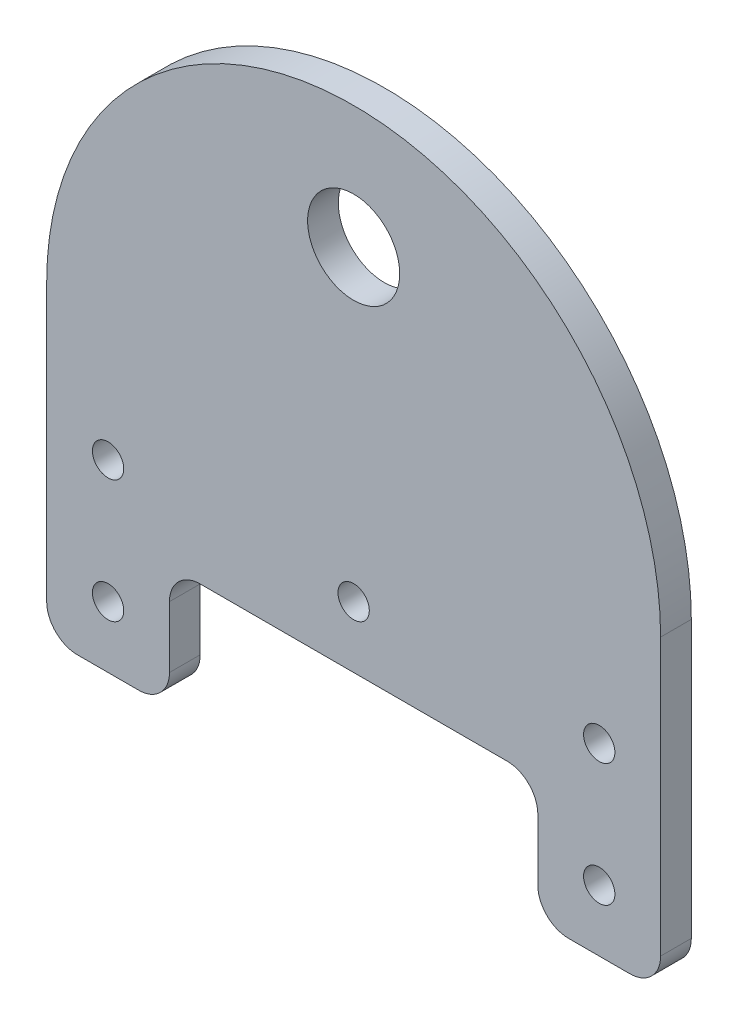
ISO-10303-21;
HEADER;
FILE_DESCRIPTION(('STEP AP214'),'2;1');
FILE_NAME('part.step','',(''),(''),'','','');
FILE_SCHEMA(('AUTOMOTIVE_DESIGN { 1 0 10303 214 1 1 1 1 }'));
ENDSEC;
DATA;
#1=APPLICATION_CONTEXT('core data for automotive mechanical design processes');
#2=APPLICATION_PROTOCOL_DEFINITION('international standard','automotive_design',2000,#1);
#3=PRODUCT_CONTEXT('',#1,'mechanical');
#4=PRODUCT('Part','Part','',(#3));
#5=PRODUCT_RELATED_PRODUCT_CATEGORY('part','',(#4));
#6=PRODUCT_DEFINITION_FORMATION('','',#4);
#7=PRODUCT_DEFINITION_CONTEXT('part definition',#1,'design');
#8=PRODUCT_DEFINITION('design','',#6,#7);
#9=PRODUCT_DEFINITION_SHAPE('','',#8);
#10=(LENGTH_UNIT() NAMED_UNIT(*) SI_UNIT(.MILLI.,.METRE.));
#11=(NAMED_UNIT(*) PLANE_ANGLE_UNIT() SI_UNIT($,.RADIAN.));
#12=(NAMED_UNIT(*) SI_UNIT($,.STERADIAN.) SOLID_ANGLE_UNIT());
#13=UNCERTAINTY_MEASURE_WITH_UNIT(LENGTH_MEASURE(1.E-05),#10,'distance_accuracy_value','');
#14=(GEOMETRIC_REPRESENTATION_CONTEXT(3) GLOBAL_UNCERTAINTY_ASSIGNED_CONTEXT((#13)) GLOBAL_UNIT_ASSIGNED_CONTEXT((#10,
#11,#12)) REPRESENTATION_CONTEXT('',''));
#15=CARTESIAN_POINT('',(0.,0.,0.));
#16=DIRECTION('',(0.,0.,1.));
#17=DIRECTION('',(1.,0.,0.));
#18=AXIS2_PLACEMENT_3D('',#15,#16,#17);
#19=CARTESIAN_POINT('',(-50.,-60.,5.));
#20=DIRECTION('',(0.,1.,0.));
#21=DIRECTION('',(0.,0.,1.));
#22=AXIS2_PLACEMENT_3D('',#19,#20,#21);
#23=PLANE('',#22);
#24=DIRECTION('',(1.,0.,0.));
#25=VECTOR('',#24,1.);
#26=CARTESIAN_POINT('',(-50.,-60.,5.));
#27=LINE('',#26,#25);
#28=CARTESIAN_POINT('',(-25.,-60.,5.));
#29=VERTEX_POINT('',#28);
#30=CARTESIAN_POINT('',(25.,-60.,5.));
#31=VERTEX_POINT('',#30);
#32=EDGE_CURVE('E154',#29,#31,#27,.T.);
#33=ORIENTED_EDGE('',*,*,#32,.F.);
#34=DIRECTION('',(0.,0.,1.));
#35=VECTOR('',#34,1.);
#36=CARTESIAN_POINT('',(-25.,-60.,5.));
#37=LINE('',#36,#35);
#38=CARTESIAN_POINT('',(-25.,-60.,0.));
#39=VERTEX_POINT('',#38);
#40=EDGE_CURVE('E201',#29,#39,#37,.F.);
#41=ORIENTED_EDGE('',*,*,#40,.T.);
#42=DIRECTION('',(1.,0.,0.));
#43=VECTOR('',#42,1.);
#44=CARTESIAN_POINT('',(-50.,-60.,0.));
#45=LINE('',#44,#43);
#46=CARTESIAN_POINT('',(25.,-60.,0.));
#47=VERTEX_POINT('',#46);
#48=EDGE_CURVE('E180',#39,#47,#45,.T.);
#49=ORIENTED_EDGE('',*,*,#48,.T.);
#50=DIRECTION('',(0.,0.,1.));
#51=VECTOR('',#50,1.);
#52=CARTESIAN_POINT('',(25.,-60.,5.));
#53=LINE('',#52,#51);
#54=EDGE_CURVE('E197',#47,#31,#53,.T.);
#55=ORIENTED_EDGE('',*,*,#54,.T.);
#56=EDGE_LOOP('',(#33,#41,#49,#55));
#57=FACE_BOUND('',#56,.T.);
#58=ADVANCED_FACE('F39',(#57),#23,.F.);
#59=CARTESIAN_POINT('',(0.,-30.,5.));
#60=DIRECTION('',(0.,0.,-1.));
#61=DIRECTION('',(-1.,0.,0.));
#62=AXIS2_PLACEMENT_3D('',#59,#60,#61);
#63=PLANE('',#62);
#64=DIRECTION('',(1.,0.,0.));
#65=VECTOR('',#64,1.);
#66=CARTESIAN_POINT('',(50.,-80.,5.));
#67=LINE('',#66,#65);
#68=CARTESIAN_POINT('',(35.,-80.,5.));
#69=VERTEX_POINT('',#68);
#70=CARTESIAN_POINT('',(45.,-80.,5.));
#71=VERTEX_POINT('',#70);
#72=EDGE_CURVE('E273',#69,#71,#67,.T.);
#73=ORIENTED_EDGE('',*,*,#72,.T.);
#74=CARTESIAN_POINT('',(45.,-75.,5.));
#75=DIRECTION('',(0.,0.,-1.));
#76=DIRECTION('',(-1.,0.,0.));
#77=AXIS2_PLACEMENT_3D('',#74,#75,#76);
#78=CIRCLE('',#77,5.);
#79=CARTESIAN_POINT('',(50.,-75.,5.));
#80=VERTEX_POINT('',#79);
#81=EDGE_CURVE('E150',#71,#80,#78,.F.);
#82=ORIENTED_EDGE('',*,*,#81,.T.);
#83=DIRECTION('',(0.,1.,0.));
#84=VECTOR('',#83,1.);
#85=CARTESIAN_POINT('',(50.,-30.,5.));
#86=LINE('',#85,#84);
#87=CARTESIAN_POINT('',(50.,-30.,5.));
#88=VERTEX_POINT('',#87);
#89=EDGE_CURVE('E141',#80,#88,#86,.T.);
#90=ORIENTED_EDGE('',*,*,#89,.T.);
#91=CARTESIAN_POINT('',(0.,-30.,5.));
#92=DIRECTION('',(0.,0.,1.));
#93=DIRECTION('',(-1.,0.,0.));
#94=AXIS2_PLACEMENT_3D('',#91,#92,#93);
#95=CIRCLE('',#94,50.);
#96=CARTESIAN_POINT('',(-50.,-30.,5.));
#97=VERTEX_POINT('',#96);
#98=EDGE_CURVE('E148',#88,#97,#95,.T.);
#99=ORIENTED_EDGE('',*,*,#98,.T.);
#100=DIRECTION('',(0.,-1.,0.));
#101=VECTOR('',#100,1.);
#102=CARTESIAN_POINT('',(-50.,-30.,5.));
#103=LINE('',#102,#101);
#104=CARTESIAN_POINT('',(-50.,-75.,5.));
#105=VERTEX_POINT('',#104);
#106=EDGE_CURVE('E189',#97,#105,#103,.T.);
#107=ORIENTED_EDGE('',*,*,#106,.T.);
#108=CARTESIAN_POINT('',(-45.,-75.,5.));
#109=DIRECTION('',(0.,0.,-1.));
#110=DIRECTION('',(-1.,0.,0.));
#111=AXIS2_PLACEMENT_3D('',#108,#109,#110);
#112=CIRCLE('',#111,5.);
#113=CARTESIAN_POINT('',(-45.,-80.,5.));
#114=VERTEX_POINT('',#113);
#115=EDGE_CURVE('E218',#105,#114,#112,.F.);
#116=ORIENTED_EDGE('',*,*,#115,.T.);
#117=DIRECTION('',(1.,0.,0.));
#118=VECTOR('',#117,1.);
#119=CARTESIAN_POINT('',(-50.,-80.,5.));
#120=LINE('',#119,#118);
#121=CARTESIAN_POINT('',(-35.,-80.,5.));
#122=VERTEX_POINT('',#121);
#123=EDGE_CURVE('E346',#114,#122,#120,.T.);
#124=ORIENTED_EDGE('',*,*,#123,.T.);
#125=CARTESIAN_POINT('',(-35.,-75.,5.));
#126=DIRECTION('',(0.,0.,-1.));
#127=DIRECTION('',(-1.,0.,0.));
#128=AXIS2_PLACEMENT_3D('',#125,#126,#127);
#129=CIRCLE('',#128,5.);
#130=CARTESIAN_POINT('',(-30.,-75.,5.));
#131=VERTEX_POINT('',#130);
#132=EDGE_CURVE('E221',#122,#131,#129,.F.);
#133=ORIENTED_EDGE('',*,*,#132,.T.);
#134=DIRECTION('',(0.,1.,0.));
#135=VECTOR('',#134,1.);
#136=CARTESIAN_POINT('',(-30.,-60.,5.));
#137=LINE('',#136,#135);
#138=CARTESIAN_POINT('',(-30.,-65.,5.));
#139=VERTEX_POINT('',#138);
#140=EDGE_CURVE('E344',#131,#139,#137,.T.);
#141=ORIENTED_EDGE('',*,*,#140,.T.);
#142=CARTESIAN_POINT('',(-25.,-65.,5.));
#143=DIRECTION('',(0.,0.,-1.));
#144=DIRECTION('',(-1.,0.,0.));
#145=AXIS2_PLACEMENT_3D('',#142,#143,#144);
#146=CIRCLE('',#145,5.);
#147=EDGE_CURVE('E253',#139,#29,#146,.T.);
#148=ORIENTED_EDGE('',*,*,#147,.T.);
#149=ORIENTED_EDGE('',*,*,#32,.T.);
#150=CARTESIAN_POINT('',(25.,-65.,5.));
#151=DIRECTION('',(0.,0.,-1.));
#152=DIRECTION('',(-1.,0.,0.));
#153=AXIS2_PLACEMENT_3D('',#150,#151,#152);
#154=CIRCLE('',#153,5.);
#155=CARTESIAN_POINT('',(30.,-65.,5.));
#156=VERTEX_POINT('',#155);
#157=EDGE_CURVE('E48',#31,#156,#154,.T.);
#158=ORIENTED_EDGE('',*,*,#157,.T.);
#159=DIRECTION('',(0.,-1.,0.));
#160=VECTOR('',#159,1.);
#161=CARTESIAN_POINT('',(30.,-60.,5.));
#162=LINE('',#161,#160);
#163=CARTESIAN_POINT('',(30.,-75.,5.));
#164=VERTEX_POINT('',#163);
#165=EDGE_CURVE('E262',#156,#164,#162,.T.);
#166=ORIENTED_EDGE('',*,*,#165,.T.);
#167=CARTESIAN_POINT('',(35.,-75.,5.));
#168=DIRECTION('',(0.,0.,-1.));
#169=DIRECTION('',(-1.,0.,0.));
#170=AXIS2_PLACEMENT_3D('',#167,#168,#169);
#171=CIRCLE('',#170,5.);
#172=EDGE_CURVE('E224',#164,#69,#171,.F.);
#173=ORIENTED_EDGE('',*,*,#172,.T.);
#174=EDGE_LOOP('',(#73,#82,#90,#99,#107,#116,#124,#133,#141,#148,#149,#158,#166,#173));
#175=FACE_BOUND('',#174,.T.);
#176=CARTESIAN_POINT('',(0.,0.,5.));
#177=DIRECTION('',(0.,0.,1.));
#178=DIRECTION('',(1.,0.,0.));
#179=AXIS2_PLACEMENT_3D('',#176,#177,#178);
#180=CIRCLE('',#179,7.5);
#181=CARTESIAN_POINT('',(7.5,0.,5.));
#182=VERTEX_POINT('',#181);
#183=EDGE_CURVE('E181',#182,#182,#180,.T.);
#184=ORIENTED_EDGE('',*,*,#183,.F.);
#185=EDGE_LOOP('',(#184));
#186=FACE_BOUND('',#185,.T.);
#187=CARTESIAN_POINT('',(0.,-50.,5.));
#188=DIRECTION('',(0.,0.,1.));
#189=DIRECTION('',(1.,0.,0.));
#190=AXIS2_PLACEMENT_3D('',#187,#188,#189);
#191=CIRCLE('',#190,2.55);
#192=CARTESIAN_POINT('',(2.55000000000001,-50.,5.));
#193=VERTEX_POINT('',#192);
#194=EDGE_CURVE('E325',#193,#193,#191,.T.);
#195=ORIENTED_EDGE('',*,*,#194,.F.);
#196=EDGE_LOOP('',(#195));
#197=FACE_BOUND('',#196,.T.);
#198=CARTESIAN_POINT('',(-40.,-50.,5.));
#199=DIRECTION('',(0.,0.,1.));
#200=DIRECTION('',(1.,0.,0.));
#201=AXIS2_PLACEMENT_3D('',#198,#199,#200);
#202=CIRCLE('',#201,2.54999999999999);
#203=CARTESIAN_POINT('',(-37.45,-50.,5.));
#204=VERTEX_POINT('',#203);
#205=EDGE_CURVE('E317',#204,#204,#202,.T.);
#206=ORIENTED_EDGE('',*,*,#205,.F.);
#207=EDGE_LOOP('',(#206));
#208=FACE_BOUND('',#207,.T.);
#209=CARTESIAN_POINT('',(40.,-50.,5.));
#210=DIRECTION('',(0.,0.,1.));
#211=DIRECTION('',(1.,0.,0.));
#212=AXIS2_PLACEMENT_3D('',#209,#210,#211);
#213=CIRCLE('',#212,2.55);
#214=CARTESIAN_POINT('',(42.55,-50.,5.));
#215=VERTEX_POINT('',#214);
#216=EDGE_CURVE('E307',#215,#215,#213,.T.);
#217=ORIENTED_EDGE('',*,*,#216,.F.);
#218=EDGE_LOOP('',(#217));
#219=FACE_BOUND('',#218,.T.);
#220=CARTESIAN_POINT('',(-40.,-70.,5.));
#221=DIRECTION('',(0.,0.,1.));
#222=DIRECTION('',(1.,0.,0.));
#223=AXIS2_PLACEMENT_3D('',#220,#221,#222);
#224=CIRCLE('',#223,2.54999999999999);
#225=CARTESIAN_POINT('',(-37.45,-70.,5.));
#226=VERTEX_POINT('',#225);
#227=EDGE_CURVE('E301',#226,#226,#224,.T.);
#228=ORIENTED_EDGE('',*,*,#227,.F.);
#229=EDGE_LOOP('',(#228));
#230=FACE_BOUND('',#229,.T.);
#231=CARTESIAN_POINT('',(40.,-70.,5.));
#232=DIRECTION('',(0.,0.,1.));
#233=DIRECTION('',(-1.,0.,0.));
#234=AXIS2_PLACEMENT_3D('',#231,#232,#233);
#235=CIRCLE('',#234,2.54999999999999);
#236=CARTESIAN_POINT('',(37.45,-70.,5.));
#237=VERTEX_POINT('',#236);
#238=EDGE_CURVE('E274',#237,#237,#235,.T.);
#239=ORIENTED_EDGE('',*,*,#238,.F.);
#240=EDGE_LOOP('',(#239));
#241=FACE_BOUND('',#240,.T.);
#242=ADVANCED_FACE('F144',(#175,#186,#197,#208,#219,#230,#241),#63,.F.);
#243=CARTESIAN_POINT('',(0.,-30.,0.));
#244=DIRECTION('',(0.,0.,-1.));
#245=DIRECTION('',(-1.,0.,0.));
#246=AXIS2_PLACEMENT_3D('',#243,#244,#245);
#247=PLANE('',#246);
#248=CARTESIAN_POINT('',(-40.,-50.,0.));
#249=DIRECTION('',(0.,0.,1.));
#250=DIRECTION('',(1.,0.,0.));
#251=AXIS2_PLACEMENT_3D('',#248,#249,#250);
#252=CIRCLE('',#251,2.54999999999999);
#253=CARTESIAN_POINT('',(-37.45,-50.,0.));
#254=VERTEX_POINT('',#253);
#255=EDGE_CURVE('E311',#254,#254,#252,.T.);
#256=ORIENTED_EDGE('',*,*,#255,.T.);
#257=EDGE_LOOP('',(#256));
#258=FACE_BOUND('',#257,.T.);
#259=CARTESIAN_POINT('',(0.,0.,0.));
#260=DIRECTION('',(0.,0.,1.));
#261=DIRECTION('',(1.,0.,0.));
#262=AXIS2_PLACEMENT_3D('',#259,#260,#261);
#263=CIRCLE('',#262,7.5);
#264=CARTESIAN_POINT('',(7.5,0.,0.));
#265=VERTEX_POINT('',#264);
#266=EDGE_CURVE('E329',#265,#265,#263,.T.);
#267=ORIENTED_EDGE('',*,*,#266,.T.);
#268=EDGE_LOOP('',(#267));
#269=FACE_BOUND('',#268,.T.);
#270=DIRECTION('',(0.,1.,0.));
#271=VECTOR('',#270,1.);
#272=CARTESIAN_POINT('',(50.,-30.,0.));
#273=LINE('',#272,#271);
#274=CARTESIAN_POINT('',(50.,-75.,0.));
#275=VERTEX_POINT('',#274);
#276=CARTESIAN_POINT('',(50.,-30.,0.));
#277=VERTEX_POINT('',#276);
#278=EDGE_CURVE('E160',#275,#277,#273,.T.);
#279=ORIENTED_EDGE('',*,*,#278,.F.);
#280=CARTESIAN_POINT('',(45.,-75.,0.));
#281=DIRECTION('',(0.,0.,-1.));
#282=DIRECTION('',(-1.,0.,0.));
#283=AXIS2_PLACEMENT_3D('',#280,#281,#282);
#284=CIRCLE('',#283,5.);
#285=CARTESIAN_POINT('',(45.,-80.,0.));
#286=VERTEX_POINT('',#285);
#287=EDGE_CURVE('E240',#275,#286,#284,.T.);
#288=ORIENTED_EDGE('',*,*,#287,.T.);
#289=DIRECTION('',(1.,0.,0.));
#290=VECTOR('',#289,1.);
#291=CARTESIAN_POINT('',(50.,-80.,0.));
#292=LINE('',#291,#290);
#293=CARTESIAN_POINT('',(35.,-80.,0.));
#294=VERTEX_POINT('',#293);
#295=EDGE_CURVE('E356',#294,#286,#292,.T.);
#296=ORIENTED_EDGE('',*,*,#295,.F.);
#297=CARTESIAN_POINT('',(35.,-75.,0.));
#298=DIRECTION('',(0.,0.,-1.));
#299=DIRECTION('',(-1.,0.,0.));
#300=AXIS2_PLACEMENT_3D('',#297,#298,#299);
#301=CIRCLE('',#300,5.);
#302=CARTESIAN_POINT('',(30.,-75.,0.));
#303=VERTEX_POINT('',#302);
#304=EDGE_CURVE('E237',#294,#303,#301,.T.);
#305=ORIENTED_EDGE('',*,*,#304,.T.);
#306=DIRECTION('',(0.,-1.,0.));
#307=VECTOR('',#306,1.);
#308=CARTESIAN_POINT('',(30.,-60.,0.));
#309=LINE('',#308,#307);
#310=CARTESIAN_POINT('',(30.,-65.,0.));
#311=VERTEX_POINT('',#310);
#312=EDGE_CURVE('E282',#311,#303,#309,.T.);
#313=ORIENTED_EDGE('',*,*,#312,.F.);
#314=CARTESIAN_POINT('',(25.,-65.,0.));
#315=DIRECTION('',(0.,0.,-1.));
#316=DIRECTION('',(-1.,0.,0.));
#317=AXIS2_PLACEMENT_3D('',#314,#315,#316);
#318=CIRCLE('',#317,5.);
#319=EDGE_CURVE('E11',#311,#47,#318,.F.);
#320=ORIENTED_EDGE('',*,*,#319,.T.);
#321=ORIENTED_EDGE('',*,*,#48,.F.);
#322=CARTESIAN_POINT('',(-25.,-65.,0.));
#323=DIRECTION('',(0.,0.,-1.));
#324=DIRECTION('',(-1.,0.,0.));
#325=AXIS2_PLACEMENT_3D('',#322,#323,#324);
#326=CIRCLE('',#325,5.);
#327=CARTESIAN_POINT('',(-30.,-65.,0.));
#328=VERTEX_POINT('',#327);
#329=EDGE_CURVE('E256',#39,#328,#326,.F.);
#330=ORIENTED_EDGE('',*,*,#329,.T.);
#331=DIRECTION('',(0.,1.,0.));
#332=VECTOR('',#331,1.);
#333=CARTESIAN_POINT('',(-30.,-60.,0.));
#334=LINE('',#333,#332);
#335=CARTESIAN_POINT('',(-30.,-75.,0.));
#336=VERTEX_POINT('',#335);
#337=EDGE_CURVE('E289',#336,#328,#334,.T.);
#338=ORIENTED_EDGE('',*,*,#337,.F.);
#339=CARTESIAN_POINT('',(-35.,-75.,0.));
#340=DIRECTION('',(0.,0.,-1.));
#341=DIRECTION('',(-1.,0.,0.));
#342=AXIS2_PLACEMENT_3D('',#339,#340,#341);
#343=CIRCLE('',#342,5.);
#344=CARTESIAN_POINT('',(-35.,-80.,0.));
#345=VERTEX_POINT('',#344);
#346=EDGE_CURVE('E55',#336,#345,#343,.T.);
#347=ORIENTED_EDGE('',*,*,#346,.T.);
#348=DIRECTION('',(1.,0.,0.));
#349=VECTOR('',#348,1.);
#350=CARTESIAN_POINT('',(-50.,-80.,0.));
#351=LINE('',#350,#349);
#352=CARTESIAN_POINT('',(-45.,-80.,0.));
#353=VERTEX_POINT('',#352);
#354=EDGE_CURVE('E296',#353,#345,#351,.T.);
#355=ORIENTED_EDGE('',*,*,#354,.F.);
#356=CARTESIAN_POINT('',(-45.,-75.,0.));
#357=DIRECTION('',(0.,0.,-1.));
#358=DIRECTION('',(-1.,0.,0.));
#359=AXIS2_PLACEMENT_3D('',#356,#357,#358);
#360=CIRCLE('',#359,5.);
#361=CARTESIAN_POINT('',(-50.,-75.,0.));
#362=VERTEX_POINT('',#361);
#363=EDGE_CURVE('E232',#353,#362,#360,.T.);
#364=ORIENTED_EDGE('',*,*,#363,.T.);
#365=DIRECTION('',(0.,-1.,0.));
#366=VECTOR('',#365,1.);
#367=CARTESIAN_POINT('',(-50.,-30.,0.));
#368=LINE('',#367,#366);
#369=CARTESIAN_POINT('',(-50.,-30.,0.));
#370=VERTEX_POINT('',#369);
#371=EDGE_CURVE('E176',#370,#362,#368,.T.);
#372=ORIENTED_EDGE('',*,*,#371,.F.);
#373=CARTESIAN_POINT('',(0.,-30.,0.));
#374=DIRECTION('',(0.,0.,1.));
#375=DIRECTION('',(-1.,0.,0.));
#376=AXIS2_PLACEMENT_3D('',#373,#374,#375);
#377=CIRCLE('',#376,50.);
#378=EDGE_CURVE('E187',#277,#370,#377,.T.);
#379=ORIENTED_EDGE('',*,*,#378,.F.);
#380=EDGE_LOOP('',(#279,#288,#296,#305,#313,#320,#321,#330,#338,#347,#355,#364,#372,#379));
#381=FACE_BOUND('',#380,.T.);
#382=CARTESIAN_POINT('',(0.,-50.,0.));
#383=DIRECTION('',(0.,0.,1.));
#384=DIRECTION('',(1.,0.,0.));
#385=AXIS2_PLACEMENT_3D('',#382,#383,#384);
#386=CIRCLE('',#385,2.55);
#387=CARTESIAN_POINT('',(2.55000000000001,-50.,0.));
#388=VERTEX_POINT('',#387);
#389=EDGE_CURVE('E321',#388,#388,#386,.T.);
#390=ORIENTED_EDGE('',*,*,#389,.T.);
#391=EDGE_LOOP('',(#390));
#392=FACE_BOUND('',#391,.T.);
#393=CARTESIAN_POINT('',(40.,-50.,0.));
#394=DIRECTION('',(0.,0.,1.));
#395=DIRECTION('',(1.,0.,0.));
#396=AXIS2_PLACEMENT_3D('',#393,#394,#395);
#397=CIRCLE('',#396,2.55);
#398=CARTESIAN_POINT('',(42.55,-50.,0.));
#399=VERTEX_POINT('',#398);
#400=EDGE_CURVE('E312',#399,#399,#397,.T.);
#401=ORIENTED_EDGE('',*,*,#400,.T.);
#402=EDGE_LOOP('',(#401));
#403=FACE_BOUND('',#402,.T.);
#404=CARTESIAN_POINT('',(-40.,-70.,0.));
#405=DIRECTION('',(0.,0.,-1.));
#406=DIRECTION('',(-1.,0.,0.));
#407=AXIS2_PLACEMENT_3D('',#404,#405,#406);
#408=CIRCLE('',#407,2.54999999999999);
#409=CARTESIAN_POINT('',(-42.55,-70.,0.));
#410=VERTEX_POINT('',#409);
#411=EDGE_CURVE('E316',#410,#410,#408,.F.);
#412=ORIENTED_EDGE('',*,*,#411,.T.);
#413=EDGE_LOOP('',(#412));
#414=FACE_BOUND('',#413,.T.);
#415=CARTESIAN_POINT('',(40.,-70.,0.));
#416=DIRECTION('',(0.,0.,-1.));
#417=DIRECTION('',(-1.,0.,0.));
#418=AXIS2_PLACEMENT_3D('',#415,#416,#417);
#419=CIRCLE('',#418,2.54999999999999);
#420=CARTESIAN_POINT('',(37.45,-70.,0.));
#421=VERTEX_POINT('',#420);
#422=EDGE_CURVE('E297',#421,#421,#419,.F.);
#423=ORIENTED_EDGE('',*,*,#422,.T.);
#424=EDGE_LOOP('',(#423));
#425=FACE_BOUND('',#424,.T.);
#426=ADVANCED_FACE('F279',(#258,#269,#381,#392,#403,#414,#425),#247,.T.);
#427=CARTESIAN_POINT('',(-50.,-30.,5.));
#428=DIRECTION('',(1.,0.,0.));
#429=DIRECTION('',(0.,0.,-1.));
#430=AXIS2_PLACEMENT_3D('',#427,#428,#429);
#431=PLANE('',#430);
#432=ORIENTED_EDGE('',*,*,#371,.T.);
#433=DIRECTION('',(0.,0.,1.));
#434=VECTOR('',#433,1.);
#435=CARTESIAN_POINT('',(-50.,-75.,5.));
#436=LINE('',#435,#434);
#437=EDGE_CURVE('E249',#362,#105,#436,.T.);
#438=ORIENTED_EDGE('',*,*,#437,.T.);
#439=ORIENTED_EDGE('',*,*,#106,.F.);
#440=DIRECTION('',(0.,0.,-1.));
#441=VECTOR('',#440,1.);
#442=CARTESIAN_POINT('',(-50.,-30.,5.));
#443=LINE('',#442,#441);
#444=EDGE_CURVE('E165',#97,#370,#443,.T.);
#445=ORIENTED_EDGE('',*,*,#444,.T.);
#446=EDGE_LOOP('',(#432,#438,#439,#445));
#447=FACE_BOUND('',#446,.T.);
#448=ADVANCED_FACE('F380',(#447),#431,.F.);
#449=CARTESIAN_POINT('',(50.,-30.,5.));
#450=DIRECTION('',(-1.,0.,0.));
#451=DIRECTION('',(0.,-1.,0.));
#452=AXIS2_PLACEMENT_3D('',#449,#450,#451);
#453=PLANE('',#452);
#454=ORIENTED_EDGE('',*,*,#89,.F.);
#455=DIRECTION('',(0.,0.,1.));
#456=VECTOR('',#455,1.);
#457=CARTESIAN_POINT('',(50.,-75.,0.));
#458=LINE('',#457,#456);
#459=EDGE_CURVE('E229',#80,#275,#458,.F.);
#460=ORIENTED_EDGE('',*,*,#459,.T.);
#461=ORIENTED_EDGE('',*,*,#278,.T.);
#462=DIRECTION('',(0.,0.,-1.));
#463=VECTOR('',#462,1.);
#464=CARTESIAN_POINT('',(50.,-30.,5.));
#465=LINE('',#464,#463);
#466=EDGE_CURVE('E157',#88,#277,#465,.T.);
#467=ORIENTED_EDGE('',*,*,#466,.F.);
#468=EDGE_LOOP('',(#454,#460,#461,#467));
#469=FACE_BOUND('',#468,.T.);
#470=ADVANCED_FACE('F158',(#469),#453,.F.);
#471=CARTESIAN_POINT('',(0.,-30.,5.));
#472=DIRECTION('',(0.,0.,-1.));
#473=DIRECTION('',(-1.,0.,0.));
#474=AXIS2_PLACEMENT_3D('',#471,#472,#473);
#475=CYLINDRICAL_SURFACE('',#474,50.);
#476=ORIENTED_EDGE('',*,*,#378,.T.);
#477=ORIENTED_EDGE('',*,*,#444,.F.);
#478=ORIENTED_EDGE('',*,*,#98,.F.);
#479=ORIENTED_EDGE('',*,*,#466,.T.);
#480=EDGE_LOOP('',(#476,#477,#478,#479));
#481=FACE_BOUND('',#480,.T.);
#482=ADVANCED_FACE('F167',(#481),#475,.T.);
#483=CARTESIAN_POINT('',(0.,0.,5.));
#484=DIRECTION('',(0.,0.,-1.));
#485=DIRECTION('',(-1.,0.,0.));
#486=AXIS2_PLACEMENT_3D('',#483,#484,#485);
#487=CYLINDRICAL_SURFACE('',#486,7.5);
#488=ORIENTED_EDGE('',*,*,#183,.T.);
#489=EDGE_LOOP('',(#488));
#490=FACE_BOUND('',#489,.T.);
#491=ORIENTED_EDGE('',*,*,#266,.F.);
#492=EDGE_LOOP('',(#491));
#493=FACE_BOUND('',#492,.T.);
#494=ADVANCED_FACE('F551',(#490,#493),#487,.F.);
#495=CARTESIAN_POINT('',(0.,-50.,5.));
#496=DIRECTION('',(0.,0.,-1.));
#497=DIRECTION('',(-1.,0.,0.));
#498=AXIS2_PLACEMENT_3D('',#495,#496,#497);
#499=CYLINDRICAL_SURFACE('',#498,2.55);
#500=ORIENTED_EDGE('',*,*,#194,.T.);
#501=EDGE_LOOP('',(#500));
#502=FACE_BOUND('',#501,.T.);
#503=ORIENTED_EDGE('',*,*,#389,.F.);
#504=EDGE_LOOP('',(#503));
#505=FACE_BOUND('',#504,.T.);
#506=ADVANCED_FACE('F543',(#502,#505),#499,.F.);
#507=CARTESIAN_POINT('',(-40.,-50.,5.));
#508=DIRECTION('',(0.,0.,-1.));
#509=DIRECTION('',(-1.,0.,0.));
#510=AXIS2_PLACEMENT_3D('',#507,#508,#509);
#511=CYLINDRICAL_SURFACE('',#510,2.54999999999999);
#512=ORIENTED_EDGE('',*,*,#205,.T.);
#513=EDGE_LOOP('',(#512));
#514=FACE_BOUND('',#513,.T.);
#515=ORIENTED_EDGE('',*,*,#255,.F.);
#516=EDGE_LOOP('',(#515));
#517=FACE_BOUND('',#516,.T.);
#518=ADVANCED_FACE('F536',(#514,#517),#511,.F.);
#519=CARTESIAN_POINT('',(40.,-50.,5.));
#520=DIRECTION('',(0.,0.,-1.));
#521=DIRECTION('',(-1.,0.,0.));
#522=AXIS2_PLACEMENT_3D('',#519,#520,#521);
#523=CYLINDRICAL_SURFACE('',#522,2.55);
#524=ORIENTED_EDGE('',*,*,#216,.T.);
#525=EDGE_LOOP('',(#524));
#526=FACE_BOUND('',#525,.T.);
#527=ORIENTED_EDGE('',*,*,#400,.F.);
#528=EDGE_LOOP('',(#527));
#529=FACE_BOUND('',#528,.T.);
#530=ADVANCED_FACE('F489',(#526,#529),#523,.F.);
#531=CARTESIAN_POINT('',(-30.,-60.,-28.2842712474619));
#532=DIRECTION('',(1.,0.,0.));
#533=DIRECTION('',(0.,1.,0.));
#534=AXIS2_PLACEMENT_3D('',#531,#532,#533);
#535=PLANE('',#534);
#536=ORIENTED_EDGE('',*,*,#337,.T.);
#537=DIRECTION('',(0.,0.,1.));
#538=VECTOR('',#537,1.);
#539=CARTESIAN_POINT('',(-30.,-65.,-28.2842712474619));
#540=LINE('',#539,#538);
#541=EDGE_CURVE('E193',#328,#139,#540,.T.);
#542=ORIENTED_EDGE('',*,*,#541,.T.);
#543=ORIENTED_EDGE('',*,*,#140,.F.);
#544=DIRECTION('',(0.,0.,1.));
#545=VECTOR('',#544,1.);
#546=CARTESIAN_POINT('',(-30.,-75.,-28.2842712474619));
#547=LINE('',#546,#545);
#548=EDGE_CURVE('E164',#131,#336,#547,.F.);
#549=ORIENTED_EDGE('',*,*,#548,.T.);
#550=EDGE_LOOP('',(#536,#542,#543,#549));
#551=FACE_BOUND('',#550,.T.);
#552=ADVANCED_FACE('F291',(#551),#535,.T.);
#553=CARTESIAN_POINT('',(-50.,-80.,-28.2842712474619));
#554=DIRECTION('',(0.,-1.,0.));
#555=DIRECTION('',(0.,0.,-1.));
#556=AXIS2_PLACEMENT_3D('',#553,#554,#555);
#557=PLANE('',#556);
#558=ORIENTED_EDGE('',*,*,#354,.T.);
#559=DIRECTION('',(0.,0.,1.));
#560=VECTOR('',#559,1.);
#561=CARTESIAN_POINT('',(-35.,-80.,-28.2842712474619));
#562=LINE('',#561,#560);
#563=EDGE_CURVE('E245',#345,#122,#562,.T.);
#564=ORIENTED_EDGE('',*,*,#563,.T.);
#565=ORIENTED_EDGE('',*,*,#123,.F.);
#566=DIRECTION('',(0.,0.,1.));
#567=VECTOR('',#566,1.);
#568=CARTESIAN_POINT('',(-45.,-80.,0.));
#569=LINE('',#568,#567);
#570=EDGE_CURVE('E62',#114,#353,#569,.F.);
#571=ORIENTED_EDGE('',*,*,#570,.T.);
#572=EDGE_LOOP('',(#558,#564,#565,#571));
#573=FACE_BOUND('',#572,.T.);
#574=ADVANCED_FACE('F383',(#573),#557,.T.);
#575=CARTESIAN_POINT('',(-40.,-70.,-28.2842712474619));
#576=DIRECTION('',(0.,0.,1.));
#577=DIRECTION('',(1.,0.,0.));
#578=AXIS2_PLACEMENT_3D('',#575,#576,#577);
#579=CYLINDRICAL_SURFACE('',#578,2.54999999999999);
#580=ORIENTED_EDGE('',*,*,#227,.T.);
#581=EDGE_LOOP('',(#580));
#582=FACE_BOUND('',#581,.T.);
#583=ORIENTED_EDGE('',*,*,#411,.F.);
#584=EDGE_LOOP('',(#583));
#585=FACE_BOUND('',#584,.T.);
#586=ADVANCED_FACE('F467',(#582,#585),#579,.F.);
#587=CARTESIAN_POINT('',(50.,-80.,-28.2842712474619));
#588=DIRECTION('',(0.,-1.,0.));
#589=DIRECTION('',(0.,0.,-1.));
#590=AXIS2_PLACEMENT_3D('',#587,#588,#589);
#591=PLANE('',#590);
#592=ORIENTED_EDGE('',*,*,#295,.T.);
#593=DIRECTION('',(0.,0.,1.));
#594=VECTOR('',#593,1.);
#595=CARTESIAN_POINT('',(45.,-80.,5.));
#596=LINE('',#595,#594);
#597=EDGE_CURVE('E214',#286,#71,#596,.T.);
#598=ORIENTED_EDGE('',*,*,#597,.T.);
#599=ORIENTED_EDGE('',*,*,#72,.F.);
#600=DIRECTION('',(0.,0.,1.));
#601=VECTOR('',#600,1.);
#602=CARTESIAN_POINT('',(35.,-80.,-28.2842712474619));
#603=LINE('',#602,#601);
#604=EDGE_CURVE('E211',#69,#294,#603,.F.);
#605=ORIENTED_EDGE('',*,*,#604,.T.);
#606=EDGE_LOOP('',(#592,#598,#599,#605));
#607=FACE_BOUND('',#606,.T.);
#608=ADVANCED_FACE('F369',(#607),#591,.T.);
#609=CARTESIAN_POINT('',(30.,-60.,-28.2842712474619));
#610=DIRECTION('',(-1.,0.,0.));
#611=DIRECTION('',(0.,-1.,0.));
#612=AXIS2_PLACEMENT_3D('',#609,#610,#611);
#613=PLANE('',#612);
#614=ORIENTED_EDGE('',*,*,#165,.F.);
#615=DIRECTION('',(0.,0.,1.));
#616=VECTOR('',#615,1.);
#617=CARTESIAN_POINT('',(30.,-65.,-28.2842712474619));
#618=LINE('',#617,#616);
#619=EDGE_CURVE('E208',#156,#311,#618,.F.);
#620=ORIENTED_EDGE('',*,*,#619,.T.);
#621=ORIENTED_EDGE('',*,*,#312,.T.);
#622=DIRECTION('',(0.,0.,1.));
#623=VECTOR('',#622,1.);
#624=CARTESIAN_POINT('',(30.,-75.,-28.2842712474619));
#625=LINE('',#624,#623);
#626=EDGE_CURVE('E204',#303,#164,#625,.T.);
#627=ORIENTED_EDGE('',*,*,#626,.T.);
#628=EDGE_LOOP('',(#614,#620,#621,#627));
#629=FACE_BOUND('',#628,.T.);
#630=ADVANCED_FACE('F268',(#629),#613,.T.);
#631=CARTESIAN_POINT('',(40.,-70.,-28.2842712474619));
#632=DIRECTION('',(0.,0.,1.));
#633=DIRECTION('',(1.,0.,0.));
#634=AXIS2_PLACEMENT_3D('',#631,#632,#633);
#635=CYLINDRICAL_SURFACE('',#634,2.54999999999999);
#636=ORIENTED_EDGE('',*,*,#238,.T.);
#637=EDGE_LOOP('',(#636));
#638=FACE_BOUND('',#637,.T.);
#639=ORIENTED_EDGE('',*,*,#422,.F.);
#640=EDGE_LOOP('',(#639));
#641=FACE_BOUND('',#640,.T.);
#642=ADVANCED_FACE('F409',(#638,#641),#635,.F.);
#643=CARTESIAN_POINT('',(-25.,-65.,-28.2842712474619));
#644=DIRECTION('',(0.,0.,1.));
#645=DIRECTION('',(1.,0.,0.));
#646=AXIS2_PLACEMENT_3D('',#643,#644,#645);
#647=CYLINDRICAL_SURFACE('',#646,5.);
#648=ORIENTED_EDGE('',*,*,#329,.F.);
#649=ORIENTED_EDGE('',*,*,#40,.F.);
#650=ORIENTED_EDGE('',*,*,#147,.F.);
#651=ORIENTED_EDGE('',*,*,#541,.F.);
#652=EDGE_LOOP('',(#648,#649,#650,#651));
#653=FACE_BOUND('',#652,.T.);
#654=ADVANCED_FACE('F286',(#653),#647,.F.);
#655=CARTESIAN_POINT('',(25.,-65.,5.));
#656=DIRECTION('',(0.,0.,1.));
#657=DIRECTION('',(1.,0.,0.));
#658=AXIS2_PLACEMENT_3D('',#655,#656,#657);
#659=CYLINDRICAL_SURFACE('',#658,5.);
#660=ORIENTED_EDGE('',*,*,#319,.F.);
#661=ORIENTED_EDGE('',*,*,#619,.F.);
#662=ORIENTED_EDGE('',*,*,#157,.F.);
#663=ORIENTED_EDGE('',*,*,#54,.F.);
#664=EDGE_LOOP('',(#660,#661,#662,#663));
#665=FACE_BOUND('',#664,.T.);
#666=ADVANCED_FACE('F277',(#665),#659,.F.);
#667=CARTESIAN_POINT('',(45.,-75.,-28.2842712474619));
#668=DIRECTION('',(0.,0.,-1.));
#669=DIRECTION('',(-1.,0.,0.));
#670=AXIS2_PLACEMENT_3D('',#667,#668,#669);
#671=CYLINDRICAL_SURFACE('',#670,5.);
#672=ORIENTED_EDGE('',*,*,#287,.F.);
#673=ORIENTED_EDGE('',*,*,#459,.F.);
#674=ORIENTED_EDGE('',*,*,#81,.F.);
#675=ORIENTED_EDGE('',*,*,#597,.F.);
#676=EDGE_LOOP('',(#672,#673,#674,#675));
#677=FACE_BOUND('',#676,.T.);
#678=ADVANCED_FACE('F377',(#677),#671,.T.);
#679=CARTESIAN_POINT('',(35.,-75.,-28.2842712474619));
#680=DIRECTION('',(0.,0.,1.));
#681=DIRECTION('',(1.,0.,0.));
#682=AXIS2_PLACEMENT_3D('',#679,#680,#681);
#683=CYLINDRICAL_SURFACE('',#682,5.);
#684=ORIENTED_EDGE('',*,*,#304,.F.);
#685=ORIENTED_EDGE('',*,*,#604,.F.);
#686=ORIENTED_EDGE('',*,*,#172,.F.);
#687=ORIENTED_EDGE('',*,*,#626,.F.);
#688=EDGE_LOOP('',(#684,#685,#686,#687));
#689=FACE_BOUND('',#688,.T.);
#690=ADVANCED_FACE('F374',(#689),#683,.T.);
#691=CARTESIAN_POINT('',(-35.,-75.,-28.2842712474619));
#692=DIRECTION('',(0.,0.,1.));
#693=DIRECTION('',(1.,0.,0.));
#694=AXIS2_PLACEMENT_3D('',#691,#692,#693);
#695=CYLINDRICAL_SURFACE('',#694,5.);
#696=ORIENTED_EDGE('',*,*,#346,.F.);
#697=ORIENTED_EDGE('',*,*,#548,.F.);
#698=ORIENTED_EDGE('',*,*,#132,.F.);
#699=ORIENTED_EDGE('',*,*,#563,.F.);
#700=EDGE_LOOP('',(#696,#697,#698,#699));
#701=FACE_BOUND('',#700,.T.);
#702=ADVANCED_FACE('F387',(#701),#695,.T.);
#703=CARTESIAN_POINT('',(-45.,-75.,5.));
#704=DIRECTION('',(0.,0.,-1.));
#705=DIRECTION('',(-1.,0.,0.));
#706=AXIS2_PLACEMENT_3D('',#703,#704,#705);
#707=CYLINDRICAL_SURFACE('',#706,5.);
#708=ORIENTED_EDGE('',*,*,#363,.F.);
#709=ORIENTED_EDGE('',*,*,#570,.F.);
#710=ORIENTED_EDGE('',*,*,#115,.F.);
#711=ORIENTED_EDGE('',*,*,#437,.F.);
#712=EDGE_LOOP('',(#708,#709,#710,#711));
#713=FACE_BOUND('',#712,.T.);
#714=ADVANCED_FACE('F41',(#713),#707,.T.);
#715=CLOSED_SHELL('',(#58,#242,#426,#448,#470,#482,#494,#506,#518,#530,#552,#574,#586,#608,#630,
#642,#654,#666,#678,#690,#702,#714));
#716=MANIFOLD_SOLID_BREP('B2',#715);
#717=ADVANCED_BREP_SHAPE_REPRESENTATION('',(#18,#716),#14);
#718=SHAPE_DEFINITION_REPRESENTATION(#9,#717);
ENDSEC;
END-ISO-10303-21;
